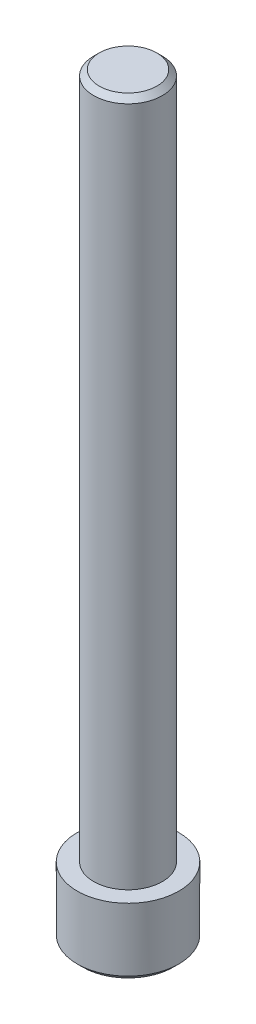
ISO-10303-21;
HEADER;
FILE_DESCRIPTION(('STEP AP214'),'2;1');
FILE_NAME('part.step','',(''),(''),'','','');
FILE_SCHEMA(('AUTOMOTIVE_DESIGN { 1 0 10303 214 1 1 1 1 }'));
ENDSEC;
DATA;
#1=APPLICATION_CONTEXT('core data for automotive mechanical design processes');
#2=APPLICATION_PROTOCOL_DEFINITION('international standard','automotive_design',2000,#1);
#3=PRODUCT_CONTEXT('',#1,'mechanical');
#4=PRODUCT('Part','Part','',(#3));
#5=PRODUCT_RELATED_PRODUCT_CATEGORY('part','',(#4));
#6=PRODUCT_DEFINITION_FORMATION('','',#4);
#7=PRODUCT_DEFINITION_CONTEXT('part definition',#1,'design');
#8=PRODUCT_DEFINITION('design','',#6,#7);
#9=PRODUCT_DEFINITION_SHAPE('','',#8);
#10=(LENGTH_UNIT() NAMED_UNIT(*) SI_UNIT(.MILLI.,.METRE.));
#11=(NAMED_UNIT(*) PLANE_ANGLE_UNIT() SI_UNIT($,.RADIAN.));
#12=(NAMED_UNIT(*) SI_UNIT($,.STERADIAN.) SOLID_ANGLE_UNIT());
#13=UNCERTAINTY_MEASURE_WITH_UNIT(LENGTH_MEASURE(1.E-05),#10,'distance_accuracy_value','');
#14=(GEOMETRIC_REPRESENTATION_CONTEXT(3) GLOBAL_UNCERTAINTY_ASSIGNED_CONTEXT((#13)) GLOBAL_UNIT_ASSIGNED_CONTEXT((#10,
#11,#12)) REPRESENTATION_CONTEXT('',''));
#15=CARTESIAN_POINT('',(0.,0.,0.));
#16=DIRECTION('',(0.,0.,1.));
#17=DIRECTION('',(1.,0.,0.));
#18=AXIS2_PLACEMENT_3D('',#15,#16,#17);
#19=CARTESIAN_POINT('',(0.,-6.35,0.));
#20=DIRECTION('',(0.,1.,0.));
#21=DIRECTION('',(0.,0.,1.));
#22=AXIS2_PLACEMENT_3D('',#19,#20,#21);
#23=PLANE('',#22);
#24=CARTESIAN_POINT('',(0.,-6.34999999999764,0.));
#25=DIRECTION('',(0.,1.,0.));
#26=DIRECTION('',(0.,0.,1.));
#27=AXIS2_PLACEMENT_3D('',#24,#25,#26);
#28=CIRCLE('',#27,4.19099999999162);
#29=CARTESIAN_POINT('',(0.,-6.34999999999764,4.19099999999162));
#30=VERTEX_POINT('',#29);
#31=EDGE_CURVE('E18',#30,#30,#28,.T.);
#32=ORIENTED_EDGE('',*,*,#31,.F.);
#33=EDGE_LOOP('',(#32));
#34=FACE_BOUND('',#33,.T.);
#35=ADVANCED_FACE('F15',(#34),#23,.F.);
#36=CARTESIAN_POINT('',(0.,-5.84199999997281,0.));
#37=DIRECTION('',(0.,1.,0.));
#38=DIRECTION('',(0.,0.,1.));
#39=AXIS2_PLACEMENT_3D('',#36,#37,#38);
#40=CONICAL_SURFACE('',#39,4.69900000001644,0.785398163397448);
#41=CARTESIAN_POINT('',(0.,-5.842,0.));
#42=DIRECTION('',(0.,-1.,0.));
#43=DIRECTION('',(0.,0.,-1.));
#44=AXIS2_PLACEMENT_3D('',#41,#42,#43);
#45=CIRCLE('',#44,4.699);
#46=CARTESIAN_POINT('',(0.,-5.842,-4.699));
#47=VERTEX_POINT('',#46);
#48=EDGE_CURVE('E36',#47,#47,#45,.F.);
#49=ORIENTED_EDGE('',*,*,#48,.F.);
#50=EDGE_LOOP('',(#49));
#51=FACE_BOUND('',#50,.T.);
#52=ORIENTED_EDGE('',*,*,#31,.T.);
#53=EDGE_LOOP('',(#52));
#54=FACE_BOUND('',#53,.T.);
#55=ADVANCED_FACE('F47',(#51,#54),#40,.T.);
#56=CARTESIAN_POINT('',(0.,63.5,0.));
#57=DIRECTION('',(0.,1.,0.));
#58=DIRECTION('',(0.,0.,1.));
#59=AXIS2_PLACEMENT_3D('',#56,#57,#58);
#60=PLANE('',#59);
#61=CARTESIAN_POINT('',(0.,63.4999999999764,0.));
#62=DIRECTION('',(0.,-1.,0.));
#63=DIRECTION('',(0.,0.,-1.));
#64=AXIS2_PLACEMENT_3D('',#61,#62,#63);
#65=CIRCLE('',#64,2.666999999974);
#66=CARTESIAN_POINT('',(0.,63.4999999999764,-2.666999999974));
#67=VERTEX_POINT('',#66);
#68=EDGE_CURVE('E34',#67,#67,#65,.T.);
#69=ORIENTED_EDGE('',*,*,#68,.F.);
#70=EDGE_LOOP('',(#69));
#71=FACE_BOUND('',#70,.T.);
#72=ADVANCED_FACE('F54',(#71),#60,.T.);
#73=CARTESIAN_POINT('',(0.,-6.35,0.));
#74=DIRECTION('',(0.,-1.,0.));
#75=DIRECTION('',(0.,0.,-1.));
#76=AXIS2_PLACEMENT_3D('',#73,#74,#75);
#77=CYLINDRICAL_SURFACE('',#76,4.699);
#78=CARTESIAN_POINT('',(0.,0.,0.));
#79=DIRECTION('',(0.,-1.,0.));
#80=DIRECTION('',(0.,0.,-1.));
#81=AXIS2_PLACEMENT_3D('',#78,#79,#80);
#82=CIRCLE('',#81,4.699);
#83=CARTESIAN_POINT('',(0.,0.,-4.699));
#84=VERTEX_POINT('',#83);
#85=EDGE_CURVE('E27',#84,#84,#82,.F.);
#86=ORIENTED_EDGE('',*,*,#85,.F.);
#87=EDGE_LOOP('',(#86));
#88=FACE_BOUND('',#87,.T.);
#89=ORIENTED_EDGE('',*,*,#48,.T.);
#90=EDGE_LOOP('',(#89));
#91=FACE_BOUND('',#90,.T.);
#92=ADVANCED_FACE('F70',(#88,#91),#77,.T.);
#93=CARTESIAN_POINT('',(0.,62.9920000000084,0.));
#94=DIRECTION('',(0.,-1.,0.));
#95=DIRECTION('',(0.,0.,-1.));
#96=AXIS2_PLACEMENT_3D('',#93,#94,#95);
#97=CONICAL_SURFACE('',#96,3.17499999994197,0.785398163397448);
#98=ORIENTED_EDGE('',*,*,#68,.T.);
#99=EDGE_LOOP('',(#98));
#100=FACE_BOUND('',#99,.T.);
#101=CARTESIAN_POINT('',(0.,62.992,0.));
#102=DIRECTION('',(0.,1.,0.));
#103=DIRECTION('',(0.,0.,1.));
#104=AXIS2_PLACEMENT_3D('',#101,#102,#103);
#105=CIRCLE('',#104,3.175);
#106=CARTESIAN_POINT('',(0.,62.992,3.175));
#107=VERTEX_POINT('',#106);
#108=EDGE_CURVE('E22',#107,#107,#105,.F.);
#109=ORIENTED_EDGE('',*,*,#108,.F.);
#110=EDGE_LOOP('',(#109));
#111=FACE_BOUND('',#110,.T.);
#112=ADVANCED_FACE('F63',(#100,#111),#97,.T.);
#113=CARTESIAN_POINT('',(0.,0.,0.));
#114=DIRECTION('',(0.,1.,0.));
#115=DIRECTION('',(0.,0.,1.));
#116=AXIS2_PLACEMENT_3D('',#113,#114,#115);
#117=PLANE('',#116);
#118=CARTESIAN_POINT('',(0.,0.,0.));
#119=DIRECTION('',(0.,1.,0.));
#120=DIRECTION('',(0.,0.,1.));
#121=AXIS2_PLACEMENT_3D('',#118,#119,#120);
#122=CIRCLE('',#121,3.175);
#123=CARTESIAN_POINT('',(0.,0.,3.175));
#124=VERTEX_POINT('',#123);
#125=EDGE_CURVE('E10',#124,#124,#122,.T.);
#126=ORIENTED_EDGE('',*,*,#125,.F.);
#127=EDGE_LOOP('',(#126));
#128=FACE_BOUND('',#127,.T.);
#129=ORIENTED_EDGE('',*,*,#85,.T.);
#130=EDGE_LOOP('',(#129));
#131=FACE_BOUND('',#130,.T.);
#132=ADVANCED_FACE('F58',(#128,#131),#117,.T.);
#133=CARTESIAN_POINT('',(0.,63.5,0.));
#134=DIRECTION('',(0.,1.,0.));
#135=DIRECTION('',(0.,0.,1.));
#136=AXIS2_PLACEMENT_3D('',#133,#134,#135);
#137=CYLINDRICAL_SURFACE('',#136,3.175);
#138=ORIENTED_EDGE('',*,*,#125,.T.);
#139=EDGE_LOOP('',(#138));
#140=FACE_BOUND('',#139,.T.);
#141=ORIENTED_EDGE('',*,*,#108,.T.);
#142=EDGE_LOOP('',(#141));
#143=FACE_BOUND('',#142,.T.);
#144=ADVANCED_FACE('F56',(#140,#143),#137,.T.);
#145=CLOSED_SHELL('',(#35,#55,#72,#92,#112,#132,#144));
#146=MANIFOLD_SOLID_BREP('B1',#145);
#147=ADVANCED_BREP_SHAPE_REPRESENTATION('',(#18,#146),#14);
#148=SHAPE_DEFINITION_REPRESENTATION(#9,#147);
ENDSEC;
END-ISO-10303-21;
